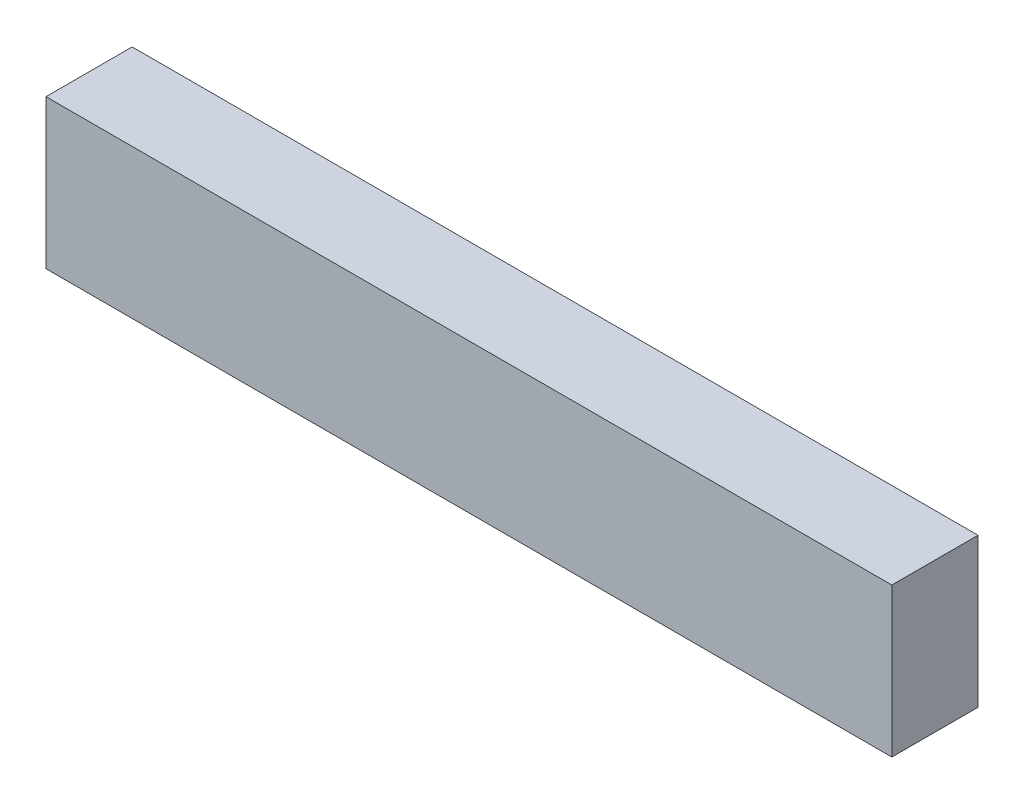
ISO-10303-21;
HEADER;
FILE_DESCRIPTION(('STEP AP214'),'2;1');
FILE_NAME('part.step','',(''),(''),'','','');
FILE_SCHEMA(('AUTOMOTIVE_DESIGN { 1 0 10303 214 1 1 1 1 }'));
ENDSEC;
DATA;
#1=APPLICATION_CONTEXT('core data for automotive mechanical design processes');
#2=APPLICATION_PROTOCOL_DEFINITION('international standard','automotive_design',2000,#1);
#3=PRODUCT_CONTEXT('',#1,'mechanical');
#4=PRODUCT('Part','Part','',(#3));
#5=PRODUCT_RELATED_PRODUCT_CATEGORY('part','',(#4));
#6=PRODUCT_DEFINITION_FORMATION('','',#4);
#7=PRODUCT_DEFINITION_CONTEXT('part definition',#1,'design');
#8=PRODUCT_DEFINITION('design','',#6,#7);
#9=PRODUCT_DEFINITION_SHAPE('','',#8);
#10=(LENGTH_UNIT() NAMED_UNIT(*) SI_UNIT(.MILLI.,.METRE.));
#11=(NAMED_UNIT(*) PLANE_ANGLE_UNIT() SI_UNIT($,.RADIAN.));
#12=(NAMED_UNIT(*) SI_UNIT($,.STERADIAN.) SOLID_ANGLE_UNIT());
#13=UNCERTAINTY_MEASURE_WITH_UNIT(LENGTH_MEASURE(1.E-05),#10,'distance_accuracy_value','');
#14=(GEOMETRIC_REPRESENTATION_CONTEXT(3) GLOBAL_UNCERTAINTY_ASSIGNED_CONTEXT((#13)) GLOBAL_UNIT_ASSIGNED_CONTEXT((#10,
#11,#12)) REPRESENTATION_CONTEXT('',''));
#15=CARTESIAN_POINT('',(0.,0.,0.));
#16=DIRECTION('',(0.,0.,1.));
#17=DIRECTION('',(1.,0.,0.));
#18=AXIS2_PLACEMENT_3D('',#15,#16,#17);
#19=CARTESIAN_POINT('',(7.86450000000038,62.07,7.25));
#20=DIRECTION('',(1.,0.,0.));
#21=DIRECTION('',(0.,1.,0.));
#22=AXIS2_PLACEMENT_3D('',#19,#20,#21);
#23=PLANE('',#22);
#24=DIRECTION('',(0.,-1.,0.));
#25=VECTOR('',#24,1.);
#26=CARTESIAN_POINT('',(7.86450000000038,62.07,0.));
#27=LINE('',#26,#25);
#28=CARTESIAN_POINT('',(7.86450000000038,62.07,0.));
#29=VERTEX_POINT('',#28);
#30=CARTESIAN_POINT('',(7.86450000000038,49.53,0.));
#31=VERTEX_POINT('',#30);
#32=EDGE_CURVE('E149',#29,#31,#27,.T.);
#33=ORIENTED_EDGE('',*,*,#32,.T.);
#34=DIRECTION('',(0.,0.,-1.));
#35=VECTOR('',#34,1.);
#36=CARTESIAN_POINT('',(7.86450000000038,49.53,7.25));
#37=LINE('',#36,#35);
#38=CARTESIAN_POINT('',(7.86450000000038,49.53,7.25));
#39=VERTEX_POINT('',#38);
#40=EDGE_CURVE('E11',#39,#31,#37,.T.);
#41=ORIENTED_EDGE('',*,*,#40,.F.);
#42=DIRECTION('',(0.,-1.,0.));
#43=VECTOR('',#42,1.);
#44=CARTESIAN_POINT('',(7.86450000000038,62.07,7.25));
#45=LINE('',#44,#43);
#46=CARTESIAN_POINT('',(7.86450000000038,62.07,7.25));
#47=VERTEX_POINT('',#46);
#48=EDGE_CURVE('E140',#47,#39,#45,.T.);
#49=ORIENTED_EDGE('',*,*,#48,.F.);
#50=DIRECTION('',(0.,0.,-1.));
#51=VECTOR('',#50,1.);
#52=CARTESIAN_POINT('',(7.86450000000038,62.07,7.25));
#53=LINE('',#52,#51);
#54=EDGE_CURVE('E55',#47,#29,#53,.T.);
#55=ORIENTED_EDGE('',*,*,#54,.T.);
#56=EDGE_LOOP('',(#33,#41,#49,#55));
#57=FACE_BOUND('',#56,.T.);
#58=ADVANCED_FACE('F32',(#57),#23,.F.);
#59=CARTESIAN_POINT('',(7.86450000000038,49.53,7.25));
#60=DIRECTION('',(0.,1.,0.));
#61=DIRECTION('',(0.,0.,1.));
#62=AXIS2_PLACEMENT_3D('',#59,#60,#61);
#63=PLANE('',#62);
#64=DIRECTION('',(1.,0.,0.));
#65=VECTOR('',#64,1.);
#66=CARTESIAN_POINT('',(7.86450000000038,49.53,0.));
#67=LINE('',#66,#65);
#68=CARTESIAN_POINT('',(79.0368014902547,49.53,0.));
#69=VERTEX_POINT('',#68);
#70=EDGE_CURVE('E151',#31,#69,#67,.T.);
#71=ORIENTED_EDGE('',*,*,#70,.T.);
#72=DIRECTION('',(0.,0.,-1.));
#73=VECTOR('',#72,1.);
#74=CARTESIAN_POINT('',(79.0368014902547,49.53,7.25));
#75=LINE('',#74,#73);
#76=CARTESIAN_POINT('',(79.0368014902547,49.53,7.25));
#77=VERTEX_POINT('',#76);
#78=EDGE_CURVE('E39',#77,#69,#75,.T.);
#79=ORIENTED_EDGE('',*,*,#78,.F.);
#80=DIRECTION('',(1.,0.,0.));
#81=VECTOR('',#80,1.);
#82=CARTESIAN_POINT('',(7.86450000000038,49.53,7.25));
#83=LINE('',#82,#81);
#84=EDGE_CURVE('E81',#39,#77,#83,.T.);
#85=ORIENTED_EDGE('',*,*,#84,.F.);
#86=ORIENTED_EDGE('',*,*,#40,.T.);
#87=EDGE_LOOP('',(#71,#79,#85,#86));
#88=FACE_BOUND('',#87,.T.);
#89=ADVANCED_FACE('F166',(#88),#63,.F.);
#90=CARTESIAN_POINT('',(79.0368014902547,62.07,7.25));
#91=DIRECTION('',(1.,0.,0.));
#92=DIRECTION('',(0.,0.,-1.));
#93=AXIS2_PLACEMENT_3D('',#90,#91,#92);
#94=PLANE('',#93);
#95=DIRECTION('',(0.,-1.,0.));
#96=VECTOR('',#95,1.);
#97=CARTESIAN_POINT('',(79.0368014902547,62.07,0.));
#98=LINE('',#97,#96);
#99=CARTESIAN_POINT('',(79.0368014902547,62.07,0.));
#100=VERTEX_POINT('',#99);
#101=EDGE_CURVE('E155',#100,#69,#98,.T.);
#102=ORIENTED_EDGE('',*,*,#101,.F.);
#103=DIRECTION('',(0.,0.,-1.));
#104=VECTOR('',#103,1.);
#105=CARTESIAN_POINT('',(79.0368014902547,62.07,7.25));
#106=LINE('',#105,#104);
#107=CARTESIAN_POINT('',(79.0368014902547,62.07,7.25));
#108=VERTEX_POINT('',#107);
#109=EDGE_CURVE('E161',#108,#100,#106,.T.);
#110=ORIENTED_EDGE('',*,*,#109,.F.);
#111=DIRECTION('',(0.,-1.,0.));
#112=VECTOR('',#111,1.);
#113=CARTESIAN_POINT('',(79.0368014902547,62.07,7.25));
#114=LINE('',#113,#112);
#115=EDGE_CURVE('E144',#108,#77,#114,.T.);
#116=ORIENTED_EDGE('',*,*,#115,.T.);
#117=ORIENTED_EDGE('',*,*,#78,.T.);
#118=EDGE_LOOP('',(#102,#110,#116,#117));
#119=FACE_BOUND('',#118,.T.);
#120=ADVANCED_FACE('F164',(#119),#94,.T.);
#121=CARTESIAN_POINT('',(7.86450000000038,62.07,7.25));
#122=DIRECTION('',(0.,1.,0.));
#123=DIRECTION('',(0.,0.,1.));
#124=AXIS2_PLACEMENT_3D('',#121,#122,#123);
#125=PLANE('',#124);
#126=DIRECTION('',(1.,0.,0.));
#127=VECTOR('',#126,1.);
#128=CARTESIAN_POINT('',(7.86450000000038,62.07,0.));
#129=LINE('',#128,#127);
#130=EDGE_CURVE('E142',#29,#100,#129,.T.);
#131=ORIENTED_EDGE('',*,*,#130,.F.);
#132=ORIENTED_EDGE('',*,*,#54,.F.);
#133=DIRECTION('',(1.,0.,0.));
#134=VECTOR('',#133,1.);
#135=CARTESIAN_POINT('',(7.86450000000038,62.07,7.25));
#136=LINE('',#135,#134);
#137=EDGE_CURVE('E147',#47,#108,#136,.T.);
#138=ORIENTED_EDGE('',*,*,#137,.T.);
#139=ORIENTED_EDGE('',*,*,#109,.T.);
#140=EDGE_LOOP('',(#131,#132,#138,#139));
#141=FACE_BOUND('',#140,.T.);
#142=ADVANCED_FACE('F170',(#141),#125,.T.);
#143=CARTESIAN_POINT('',(0.,0.,7.25));
#144=DIRECTION('',(0.,0.,1.));
#145=DIRECTION('',(1.,0.,0.));
#146=AXIS2_PLACEMENT_3D('',#143,#144,#145);
#147=PLANE('',#146);
#148=ORIENTED_EDGE('',*,*,#48,.T.);
#149=ORIENTED_EDGE('',*,*,#84,.T.);
#150=ORIENTED_EDGE('',*,*,#115,.F.);
#151=ORIENTED_EDGE('',*,*,#137,.F.);
#152=EDGE_LOOP('',(#148,#149,#150,#151));
#153=FACE_BOUND('',#152,.T.);
#154=ADVANCED_FACE('F173',(#153),#147,.T.);
#155=CARTESIAN_POINT('',(0.,0.,0.));
#156=DIRECTION('',(0.,0.,1.));
#157=DIRECTION('',(1.,0.,0.));
#158=AXIS2_PLACEMENT_3D('',#155,#156,#157);
#159=PLANE('',#158);
#160=DIRECTION('',(1.,0.,0.));
#161=VECTOR('',#160,1.);
#162=CARTESIAN_POINT('',(7.86450000000038,61.57,0.));
#163=LINE('',#162,#161);
#164=CARTESIAN_POINT('',(8.36450000000038,61.57,0.));
#165=VERTEX_POINT('',#164);
#166=CARTESIAN_POINT('',(78.5368014902547,61.57,0.));
#167=VERTEX_POINT('',#166);
#168=EDGE_CURVE('E125',#165,#167,#163,.T.);
#169=ORIENTED_EDGE('',*,*,#168,.F.);
#170=DIRECTION('',(0.,-1.,0.));
#171=VECTOR('',#170,1.);
#172=CARTESIAN_POINT('',(8.36450000000038,62.07,0.));
#173=LINE('',#172,#171);
#174=CARTESIAN_POINT('',(8.36450000000038,50.03,0.));
#175=VERTEX_POINT('',#174);
#176=EDGE_CURVE('E112',#165,#175,#173,.T.);
#177=ORIENTED_EDGE('',*,*,#176,.T.);
#178=DIRECTION('',(1.,0.,0.));
#179=VECTOR('',#178,1.);
#180=CARTESIAN_POINT('',(7.86450000000038,50.03,0.));
#181=LINE('',#180,#179);
#182=CARTESIAN_POINT('',(78.5368014902547,50.03,0.));
#183=VERTEX_POINT('',#182);
#184=EDGE_CURVE('E135',#175,#183,#181,.T.);
#185=ORIENTED_EDGE('',*,*,#184,.T.);
#186=DIRECTION('',(0.,-1.,0.));
#187=VECTOR('',#186,1.);
#188=CARTESIAN_POINT('',(78.5368014902547,62.07,0.));
#189=LINE('',#188,#187);
#190=EDGE_CURVE('E46',#167,#183,#189,.T.);
#191=ORIENTED_EDGE('',*,*,#190,.F.);
#192=EDGE_LOOP('',(#169,#177,#185,#191));
#193=FACE_BOUND('',#192,.T.);
#194=ORIENTED_EDGE('',*,*,#32,.F.);
#195=ORIENTED_EDGE('',*,*,#130,.T.);
#196=ORIENTED_EDGE('',*,*,#101,.T.);
#197=ORIENTED_EDGE('',*,*,#70,.F.);
#198=EDGE_LOOP('',(#194,#195,#196,#197));
#199=FACE_BOUND('',#198,.T.);
#200=ADVANCED_FACE('F169',(#193,#199),#159,.F.);
#201=CARTESIAN_POINT('',(8.36450000000038,62.07,7.25));
#202=DIRECTION('',(1.,0.,0.));
#203=DIRECTION('',(0.,1.,0.));
#204=AXIS2_PLACEMENT_3D('',#201,#202,#203);
#205=PLANE('',#204);
#206=ORIENTED_EDGE('',*,*,#176,.F.);
#207=DIRECTION('',(0.,0.,-1.));
#208=VECTOR('',#207,1.);
#209=CARTESIAN_POINT('',(8.36450000000038,61.57,7.25));
#210=LINE('',#209,#208);
#211=CARTESIAN_POINT('',(8.36450000000038,61.57,7.05));
#212=VERTEX_POINT('',#211);
#213=EDGE_CURVE('E105',#212,#165,#210,.T.);
#214=ORIENTED_EDGE('',*,*,#213,.F.);
#215=DIRECTION('',(0.,-1.,0.));
#216=VECTOR('',#215,1.);
#217=CARTESIAN_POINT('',(8.36450000000038,62.07,7.05));
#218=LINE('',#217,#216);
#219=CARTESIAN_POINT('',(8.36450000000038,50.03,7.05));
#220=VERTEX_POINT('',#219);
#221=EDGE_CURVE('E109',#212,#220,#218,.T.);
#222=ORIENTED_EDGE('',*,*,#221,.T.);
#223=DIRECTION('',(0.,0.,-1.));
#224=VECTOR('',#223,1.);
#225=CARTESIAN_POINT('',(8.36450000000038,50.03,7.25));
#226=LINE('',#225,#224);
#227=EDGE_CURVE('E152',#220,#175,#226,.T.);
#228=ORIENTED_EDGE('',*,*,#227,.T.);
#229=EDGE_LOOP('',(#206,#214,#222,#228));
#230=FACE_BOUND('',#229,.T.);
#231=ADVANCED_FACE('F107',(#230),#205,.T.);
#232=CARTESIAN_POINT('',(7.86450000000038,50.03,7.25));
#233=DIRECTION('',(0.,1.,0.));
#234=DIRECTION('',(0.,0.,1.));
#235=AXIS2_PLACEMENT_3D('',#232,#233,#234);
#236=PLANE('',#235);
#237=ORIENTED_EDGE('',*,*,#184,.F.);
#238=ORIENTED_EDGE('',*,*,#227,.F.);
#239=DIRECTION('',(1.,0.,0.));
#240=VECTOR('',#239,1.);
#241=CARTESIAN_POINT('',(7.86450000000038,50.03,7.05));
#242=LINE('',#241,#240);
#243=CARTESIAN_POINT('',(78.5368014902547,50.03,7.05));
#244=VERTEX_POINT('',#243);
#245=EDGE_CURVE('E124',#220,#244,#242,.T.);
#246=ORIENTED_EDGE('',*,*,#245,.T.);
#247=DIRECTION('',(0.,0.,-1.));
#248=VECTOR('',#247,1.);
#249=CARTESIAN_POINT('',(78.5368014902547,50.03,7.25));
#250=LINE('',#249,#248);
#251=EDGE_CURVE('E264',#244,#183,#250,.T.);
#252=ORIENTED_EDGE('',*,*,#251,.T.);
#253=EDGE_LOOP('',(#237,#238,#246,#252));
#254=FACE_BOUND('',#253,.T.);
#255=ADVANCED_FACE('F197',(#254),#236,.T.);
#256=CARTESIAN_POINT('',(78.5368014902547,62.07,7.25));
#257=DIRECTION('',(1.,0.,0.));
#258=DIRECTION('',(0.,0.,-1.));
#259=AXIS2_PLACEMENT_3D('',#256,#257,#258);
#260=PLANE('',#259);
#261=ORIENTED_EDGE('',*,*,#190,.T.);
#262=ORIENTED_EDGE('',*,*,#251,.F.);
#263=DIRECTION('',(0.,-1.,0.));
#264=VECTOR('',#263,1.);
#265=CARTESIAN_POINT('',(78.5368014902547,62.07,7.05));
#266=LINE('',#265,#264);
#267=CARTESIAN_POINT('',(78.5368014902547,61.57,7.05));
#268=VERTEX_POINT('',#267);
#269=EDGE_CURVE('E129',#268,#244,#266,.T.);
#270=ORIENTED_EDGE('',*,*,#269,.F.);
#271=DIRECTION('',(0.,0.,-1.));
#272=VECTOR('',#271,1.);
#273=CARTESIAN_POINT('',(78.5368014902547,61.57,7.25));
#274=LINE('',#273,#272);
#275=EDGE_CURVE('E117',#268,#167,#274,.T.);
#276=ORIENTED_EDGE('',*,*,#275,.T.);
#277=EDGE_LOOP('',(#261,#262,#270,#276));
#278=FACE_BOUND('',#277,.T.);
#279=ADVANCED_FACE('F194',(#278),#260,.F.);
#280=CARTESIAN_POINT('',(7.86450000000038,61.57,7.25));
#281=DIRECTION('',(0.,1.,0.));
#282=DIRECTION('',(0.,0.,1.));
#283=AXIS2_PLACEMENT_3D('',#280,#281,#282);
#284=PLANE('',#283);
#285=ORIENTED_EDGE('',*,*,#168,.T.);
#286=ORIENTED_EDGE('',*,*,#275,.F.);
#287=DIRECTION('',(1.,0.,0.));
#288=VECTOR('',#287,1.);
#289=CARTESIAN_POINT('',(7.86450000000038,61.57,7.05));
#290=LINE('',#289,#288);
#291=EDGE_CURVE('E118',#212,#268,#290,.T.);
#292=ORIENTED_EDGE('',*,*,#291,.F.);
#293=ORIENTED_EDGE('',*,*,#213,.T.);
#294=EDGE_LOOP('',(#285,#286,#292,#293));
#295=FACE_BOUND('',#294,.T.);
#296=ADVANCED_FACE('F127',(#295),#284,.F.);
#297=CARTESIAN_POINT('',(0.,0.,7.05));
#298=DIRECTION('',(0.,0.,1.));
#299=DIRECTION('',(1.,0.,0.));
#300=AXIS2_PLACEMENT_3D('',#297,#298,#299);
#301=PLANE('',#300);
#302=ORIENTED_EDGE('',*,*,#221,.F.);
#303=ORIENTED_EDGE('',*,*,#291,.T.);
#304=ORIENTED_EDGE('',*,*,#269,.T.);
#305=ORIENTED_EDGE('',*,*,#245,.F.);
#306=EDGE_LOOP('',(#302,#303,#304,#305));
#307=FACE_BOUND('',#306,.T.);
#308=ADVANCED_FACE('F122',(#307),#301,.F.);
#309=CLOSED_SHELL('',(#58,#89,#120,#142,#154,#200,#231,#255,#279,#296,#308));
#310=MANIFOLD_SOLID_BREP('B2',#309);
#311=ADVANCED_BREP_SHAPE_REPRESENTATION('',(#18,#310),#14);
#312=SHAPE_DEFINITION_REPRESENTATION(#9,#311);
ENDSEC;
END-ISO-10303-21;
